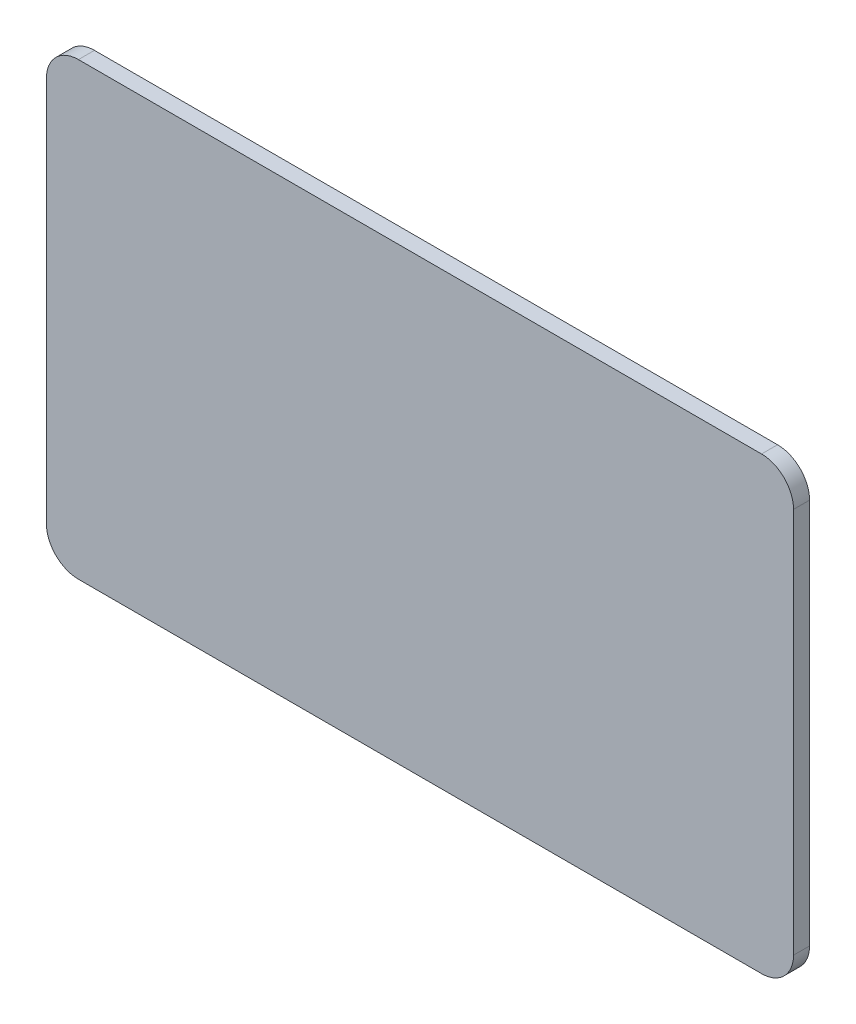
ISO-10303-21;
HEADER;
FILE_DESCRIPTION(('STEP AP214'),'2;1');
FILE_NAME('part.step','',(''),(''),'','','');
FILE_SCHEMA(('AUTOMOTIVE_DESIGN { 1 0 10303 214 1 1 1 1 }'));
ENDSEC;
DATA;
#1=APPLICATION_CONTEXT('core data for automotive mechanical design processes');
#2=APPLICATION_PROTOCOL_DEFINITION('international standard','automotive_design',2000,#1);
#3=PRODUCT_CONTEXT('',#1,'mechanical');
#4=PRODUCT('Part','Part','',(#3));
#5=PRODUCT_RELATED_PRODUCT_CATEGORY('part','',(#4));
#6=PRODUCT_DEFINITION_FORMATION('','',#4);
#7=PRODUCT_DEFINITION_CONTEXT('part definition',#1,'design');
#8=PRODUCT_DEFINITION('design','',#6,#7);
#9=PRODUCT_DEFINITION_SHAPE('','',#8);
#10=(LENGTH_UNIT() NAMED_UNIT(*) SI_UNIT(.MILLI.,.METRE.));
#11=(NAMED_UNIT(*) PLANE_ANGLE_UNIT() SI_UNIT($,.RADIAN.));
#12=(NAMED_UNIT(*) SI_UNIT($,.STERADIAN.) SOLID_ANGLE_UNIT());
#13=UNCERTAINTY_MEASURE_WITH_UNIT(LENGTH_MEASURE(1.E-05),#10,'distance_accuracy_value','');
#14=(GEOMETRIC_REPRESENTATION_CONTEXT(3) GLOBAL_UNCERTAINTY_ASSIGNED_CONTEXT((#13)) GLOBAL_UNIT_ASSIGNED_CONTEXT((#10,
#11,#12)) REPRESENTATION_CONTEXT('',''));
#15=CARTESIAN_POINT('',(0.,0.,0.));
#16=DIRECTION('',(0.,0.,1.));
#17=DIRECTION('',(1.,0.,0.));
#18=AXIS2_PLACEMENT_3D('',#15,#16,#17);
#19=CARTESIAN_POINT('',(23.3495549956615,10.8485399733171,1.));
#20=DIRECTION('',(-1.,0.,0.));
#21=DIRECTION('',(0.,-1.,0.));
#22=AXIS2_PLACEMENT_3D('',#19,#20,#21);
#23=PLANE('',#22);
#24=DIRECTION('',(0.,1.,0.));
#25=VECTOR('',#24,1.);
#26=CARTESIAN_POINT('',(23.3495549956615,10.8485399733171,1.));
#27=LINE('',#26,#25);
#28=CARTESIAN_POINT('',(23.3495549956615,-15.2838407678688,1.));
#29=VERTEX_POINT('',#28);
#30=CARTESIAN_POINT('',(23.3495549956615,8.84853997331711,1.));
#31=VERTEX_POINT('',#30);
#32=EDGE_CURVE('E118',#29,#31,#27,.T.);
#33=ORIENTED_EDGE('',*,*,#32,.F.);
#34=DIRECTION('',(0.,0.,-1.));
#35=VECTOR('',#34,1.);
#36=CARTESIAN_POINT('',(23.3495549956615,-15.2838407678688,1.));
#37=LINE('',#36,#35);
#38=CARTESIAN_POINT('',(23.3495549956615,-15.2838407678688,0.));
#39=VERTEX_POINT('',#38);
#40=EDGE_CURVE('E103',#29,#39,#37,.T.);
#41=ORIENTED_EDGE('',*,*,#40,.T.);
#42=DIRECTION('',(0.,1.,0.));
#43=VECTOR('',#42,1.);
#44=CARTESIAN_POINT('',(23.3495549956615,10.8485399733171,0.));
#45=LINE('',#44,#43);
#46=CARTESIAN_POINT('',(23.3495549956615,8.84853997331711,0.));
#47=VERTEX_POINT('',#46);
#48=EDGE_CURVE('E115',#39,#47,#45,.T.);
#49=ORIENTED_EDGE('',*,*,#48,.T.);
#50=DIRECTION('',(0.,0.,-1.));
#51=VECTOR('',#50,1.);
#52=CARTESIAN_POINT('',(23.3495549956615,8.84853997331711,1.));
#53=LINE('',#52,#51);
#54=EDGE_CURVE('E120',#47,#31,#53,.F.);
#55=ORIENTED_EDGE('',*,*,#54,.T.);
#56=EDGE_LOOP('',(#33,#41,#49,#55));
#57=FACE_BOUND('',#56,.T.);
#58=ADVANCED_FACE('F33',(#57),#23,.F.);
#59=CARTESIAN_POINT('',(-23.3495549956615,10.8485399733171,1.));
#60=DIRECTION('',(0.,-1.,0.));
#61=DIRECTION('',(0.,0.,-1.));
#62=AXIS2_PLACEMENT_3D('',#59,#60,#61);
#63=PLANE('',#62);
#64=DIRECTION('',(-1.,0.,0.));
#65=VECTOR('',#64,1.);
#66=CARTESIAN_POINT('',(-23.3495549956615,10.8485399733171,0.));
#67=LINE('',#66,#65);
#68=CARTESIAN_POINT('',(21.3495549956615,10.8485399733171,0.));
#69=VERTEX_POINT('',#68);
#70=CARTESIAN_POINT('',(-21.3495549956615,10.8485399733171,0.));
#71=VERTEX_POINT('',#70);
#72=EDGE_CURVE('E124',#69,#71,#67,.T.);
#73=ORIENTED_EDGE('',*,*,#72,.T.);
#74=DIRECTION('',(0.,0.,-1.));
#75=VECTOR('',#74,1.);
#76=CARTESIAN_POINT('',(-21.3495549956615,10.8485399733171,1.));
#77=LINE('',#76,#75);
#78=CARTESIAN_POINT('',(-21.3495549956615,10.8485399733171,1.));
#79=VERTEX_POINT('',#78);
#80=EDGE_CURVE('E11',#71,#79,#77,.F.);
#81=ORIENTED_EDGE('',*,*,#80,.T.);
#82=DIRECTION('',(-1.,0.,0.));
#83=VECTOR('',#82,1.);
#84=CARTESIAN_POINT('',(-23.3495549956615,10.8485399733171,1.));
#85=LINE('',#84,#83);
#86=CARTESIAN_POINT('',(21.3495549956615,10.8485399733171,1.));
#87=VERTEX_POINT('',#86);
#88=EDGE_CURVE('E160',#87,#79,#85,.T.);
#89=ORIENTED_EDGE('',*,*,#88,.F.);
#90=DIRECTION('',(0.,0.,-1.));
#91=VECTOR('',#90,1.);
#92=CARTESIAN_POINT('',(21.3495549956615,10.8485399733171,1.));
#93=LINE('',#92,#91);
#94=EDGE_CURVE('E41',#87,#69,#93,.T.);
#95=ORIENTED_EDGE('',*,*,#94,.T.);
#96=EDGE_LOOP('',(#73,#81,#89,#95));
#97=FACE_BOUND('',#96,.T.);
#98=ADVANCED_FACE('F158',(#97),#63,.F.);
#99=CARTESIAN_POINT('',(-23.3495549956615,10.8485399733171,1.));
#100=DIRECTION('',(1.,0.,0.));
#101=DIRECTION('',(0.,0.,-1.));
#102=AXIS2_PLACEMENT_3D('',#99,#100,#101);
#103=PLANE('',#102);
#104=DIRECTION('',(0.,-1.,0.));
#105=VECTOR('',#104,1.);
#106=CARTESIAN_POINT('',(-23.3495549956615,10.8485399733171,0.));
#107=LINE('',#106,#105);
#108=CARTESIAN_POINT('',(-23.3495549956615,8.84853997331711,0.));
#109=VERTEX_POINT('',#108);
#110=CARTESIAN_POINT('',(-23.3495549956615,-15.2838407678688,0.));
#111=VERTEX_POINT('',#110);
#112=EDGE_CURVE('E127',#109,#111,#107,.T.);
#113=ORIENTED_EDGE('',*,*,#112,.T.);
#114=DIRECTION('',(0.,0.,-1.));
#115=VECTOR('',#114,1.);
#116=CARTESIAN_POINT('',(-23.3495549956615,-15.2838407678688,1.));
#117=LINE('',#116,#115);
#118=CARTESIAN_POINT('',(-23.3495549956615,-15.2838407678688,1.));
#119=VERTEX_POINT('',#118);
#120=EDGE_CURVE('E48',#111,#119,#117,.F.);
#121=ORIENTED_EDGE('',*,*,#120,.T.);
#122=DIRECTION('',(0.,-1.,0.));
#123=VECTOR('',#122,1.);
#124=CARTESIAN_POINT('',(-23.3495549956615,10.8485399733171,1.));
#125=LINE('',#124,#123);
#126=CARTESIAN_POINT('',(-23.3495549956615,8.84853997331711,1.));
#127=VERTEX_POINT('',#126);
#128=EDGE_CURVE('E168',#127,#119,#125,.T.);
#129=ORIENTED_EDGE('',*,*,#128,.F.);
#130=DIRECTION('',(0.,0.,-1.));
#131=VECTOR('',#130,1.);
#132=CARTESIAN_POINT('',(-23.3495549956615,8.84853997331711,1.));
#133=LINE('',#132,#131);
#134=EDGE_CURVE('E151',#127,#109,#133,.T.);
#135=ORIENTED_EDGE('',*,*,#134,.T.);
#136=EDGE_LOOP('',(#113,#121,#129,#135));
#137=FACE_BOUND('',#136,.T.);
#138=ADVANCED_FACE('F167',(#137),#103,.F.);
#139=CARTESIAN_POINT('',(-23.3495549956615,-17.2838407678688,1.));
#140=DIRECTION('',(0.,1.,0.));
#141=DIRECTION('',(0.,0.,1.));
#142=AXIS2_PLACEMENT_3D('',#139,#140,#141);
#143=PLANE('',#142);
#144=DIRECTION('',(1.,0.,0.));
#145=VECTOR('',#144,1.);
#146=CARTESIAN_POINT('',(-23.3495549956615,-17.2838407678688,0.));
#147=LINE('',#146,#145);
#148=CARTESIAN_POINT('',(-21.3495549956615,-17.2838407678688,0.));
#149=VERTEX_POINT('',#148);
#150=CARTESIAN_POINT('',(21.3495549956615,-17.2838407678688,0.));
#151=VERTEX_POINT('',#150);
#152=EDGE_CURVE('E134',#149,#151,#147,.T.);
#153=ORIENTED_EDGE('',*,*,#152,.T.);
#154=DIRECTION('',(0.,0.,-1.));
#155=VECTOR('',#154,1.);
#156=CARTESIAN_POINT('',(21.3495549956615,-17.2838407678688,1.));
#157=LINE('',#156,#155);
#158=CARTESIAN_POINT('',(21.3495549956615,-17.2838407678688,1.));
#159=VERTEX_POINT('',#158);
#160=EDGE_CURVE('E104',#151,#159,#157,.F.);
#161=ORIENTED_EDGE('',*,*,#160,.T.);
#162=DIRECTION('',(1.,0.,0.));
#163=VECTOR('',#162,1.);
#164=CARTESIAN_POINT('',(-23.3495549956615,-17.2838407678688,1.));
#165=LINE('',#164,#163);
#166=CARTESIAN_POINT('',(-21.3495549956615,-17.2838407678688,1.));
#167=VERTEX_POINT('',#166);
#168=EDGE_CURVE('E130',#167,#159,#165,.T.);
#169=ORIENTED_EDGE('',*,*,#168,.F.);
#170=DIRECTION('',(0.,0.,-1.));
#171=VECTOR('',#170,1.);
#172=CARTESIAN_POINT('',(-21.3495549956615,-17.2838407678688,1.));
#173=LINE('',#172,#171);
#174=EDGE_CURVE('E109',#167,#149,#173,.T.);
#175=ORIENTED_EDGE('',*,*,#174,.T.);
#176=EDGE_LOOP('',(#153,#161,#169,#175));
#177=FACE_BOUND('',#176,.T.);
#178=ADVANCED_FACE('F196',(#177),#143,.F.);
#179=CARTESIAN_POINT('',(0.,0.,1.));
#180=DIRECTION('',(0.,0.,1.));
#181=DIRECTION('',(1.,0.,0.));
#182=AXIS2_PLACEMENT_3D('',#179,#180,#181);
#183=PLANE('',#182);
#184=ORIENTED_EDGE('',*,*,#168,.T.);
#185=CARTESIAN_POINT('',(21.3495549956615,-15.2838407678688,1.));
#186=DIRECTION('',(0.,0.,1.));
#187=DIRECTION('',(1.,0.,0.));
#188=AXIS2_PLACEMENT_3D('',#185,#186,#187);
#189=CIRCLE('',#188,2.);
#190=EDGE_CURVE('E149',#159,#29,#189,.T.);
#191=ORIENTED_EDGE('',*,*,#190,.T.);
#192=ORIENTED_EDGE('',*,*,#32,.T.);
#193=CARTESIAN_POINT('',(21.3495549956615,8.84853997331711,1.));
#194=DIRECTION('',(0.,0.,1.));
#195=DIRECTION('',(1.,0.,0.));
#196=AXIS2_PLACEMENT_3D('',#193,#194,#195);
#197=CIRCLE('',#196,2.);
#198=EDGE_CURVE('E144',#31,#87,#197,.T.);
#199=ORIENTED_EDGE('',*,*,#198,.T.);
#200=ORIENTED_EDGE('',*,*,#88,.T.);
#201=CARTESIAN_POINT('',(-21.3495549956615,8.84853997331711,1.));
#202=DIRECTION('',(0.,0.,1.));
#203=DIRECTION('',(1.,0.,0.));
#204=AXIS2_PLACEMENT_3D('',#201,#202,#203);
#205=CIRCLE('',#204,2.);
#206=EDGE_CURVE('E55',#79,#127,#205,.T.);
#207=ORIENTED_EDGE('',*,*,#206,.T.);
#208=ORIENTED_EDGE('',*,*,#128,.T.);
#209=CARTESIAN_POINT('',(-21.3495549956615,-15.2838407678688,1.));
#210=DIRECTION('',(0.,0.,1.));
#211=DIRECTION('',(1.,0.,0.));
#212=AXIS2_PLACEMENT_3D('',#209,#210,#211);
#213=CIRCLE('',#212,2.);
#214=EDGE_CURVE('E147',#119,#167,#213,.T.);
#215=ORIENTED_EDGE('',*,*,#214,.T.);
#216=EDGE_LOOP('',(#184,#191,#192,#199,#200,#207,#208,#215));
#217=FACE_BOUND('',#216,.T.);
#218=ADVANCED_FACE('F173',(#217),#183,.T.);
#219=CARTESIAN_POINT('',(0.,0.,0.));
#220=DIRECTION('',(0.,0.,1.));
#221=DIRECTION('',(1.,0.,0.));
#222=AXIS2_PLACEMENT_3D('',#219,#220,#221);
#223=PLANE('',#222);
#224=ORIENTED_EDGE('',*,*,#48,.F.);
#225=CARTESIAN_POINT('',(21.3495549956615,-15.2838407678688,0.));
#226=DIRECTION('',(0.,0.,1.));
#227=DIRECTION('',(1.,0.,0.));
#228=AXIS2_PLACEMENT_3D('',#225,#226,#227);
#229=CIRCLE('',#228,2.);
#230=EDGE_CURVE('E99',#39,#151,#229,.F.);
#231=ORIENTED_EDGE('',*,*,#230,.T.);
#232=ORIENTED_EDGE('',*,*,#152,.F.);
#233=CARTESIAN_POINT('',(-21.3495549956615,-15.2838407678688,0.));
#234=DIRECTION('',(0.,0.,1.));
#235=DIRECTION('',(1.,0.,0.));
#236=AXIS2_PLACEMENT_3D('',#233,#234,#235);
#237=CIRCLE('',#236,2.);
#238=EDGE_CURVE('E110',#149,#111,#237,.F.);
#239=ORIENTED_EDGE('',*,*,#238,.T.);
#240=ORIENTED_EDGE('',*,*,#112,.F.);
#241=CARTESIAN_POINT('',(-21.3495549956615,8.84853997331711,0.));
#242=DIRECTION('',(0.,0.,1.));
#243=DIRECTION('',(1.,0.,0.));
#244=AXIS2_PLACEMENT_3D('',#241,#242,#243);
#245=CIRCLE('',#244,2.);
#246=EDGE_CURVE('E138',#109,#71,#245,.F.);
#247=ORIENTED_EDGE('',*,*,#246,.T.);
#248=ORIENTED_EDGE('',*,*,#72,.F.);
#249=CARTESIAN_POINT('',(21.3495549956615,8.84853997331711,0.));
#250=DIRECTION('',(0.,0.,1.));
#251=DIRECTION('',(1.,0.,0.));
#252=AXIS2_PLACEMENT_3D('',#249,#250,#251);
#253=CIRCLE('',#252,2.);
#254=EDGE_CURVE('E119',#69,#47,#253,.F.);
#255=ORIENTED_EDGE('',*,*,#254,.T.);
#256=EDGE_LOOP('',(#224,#231,#232,#239,#240,#247,#248,#255));
#257=FACE_BOUND('',#256,.T.);
#258=ADVANCED_FACE('F122',(#257),#223,.F.);
#259=CARTESIAN_POINT('',(21.3495549956615,-15.2838407678688,1.));
#260=DIRECTION('',(0.,0.,-1.));
#261=DIRECTION('',(-1.,0.,0.));
#262=AXIS2_PLACEMENT_3D('',#259,#260,#261);
#263=CYLINDRICAL_SURFACE('',#262,2.);
#264=ORIENTED_EDGE('',*,*,#190,.F.);
#265=ORIENTED_EDGE('',*,*,#160,.F.);
#266=ORIENTED_EDGE('',*,*,#230,.F.);
#267=ORIENTED_EDGE('',*,*,#40,.F.);
#268=EDGE_LOOP('',(#264,#265,#266,#267));
#269=FACE_BOUND('',#268,.T.);
#270=ADVANCED_FACE('F102',(#269),#263,.T.);
#271=CARTESIAN_POINT('',(-21.3495549956615,-15.2838407678688,1.));
#272=DIRECTION('',(0.,0.,-1.));
#273=DIRECTION('',(-1.,0.,0.));
#274=AXIS2_PLACEMENT_3D('',#271,#272,#273);
#275=CYLINDRICAL_SURFACE('',#274,2.);
#276=ORIENTED_EDGE('',*,*,#214,.F.);
#277=ORIENTED_EDGE('',*,*,#120,.F.);
#278=ORIENTED_EDGE('',*,*,#238,.F.);
#279=ORIENTED_EDGE('',*,*,#174,.F.);
#280=EDGE_LOOP('',(#276,#277,#278,#279));
#281=FACE_BOUND('',#280,.T.);
#282=ADVANCED_FACE('F178',(#281),#275,.T.);
#283=CARTESIAN_POINT('',(-21.3495549956615,8.84853997331711,1.));
#284=DIRECTION('',(0.,0.,-1.));
#285=DIRECTION('',(-1.,0.,0.));
#286=AXIS2_PLACEMENT_3D('',#283,#284,#285);
#287=CYLINDRICAL_SURFACE('',#286,2.);
#288=ORIENTED_EDGE('',*,*,#206,.F.);
#289=ORIENTED_EDGE('',*,*,#80,.F.);
#290=ORIENTED_EDGE('',*,*,#246,.F.);
#291=ORIENTED_EDGE('',*,*,#134,.F.);
#292=EDGE_LOOP('',(#288,#289,#290,#291));
#293=FACE_BOUND('',#292,.T.);
#294=ADVANCED_FACE('F166',(#293),#287,.T.);
#295=CARTESIAN_POINT('',(21.3495549956615,8.84853997331711,1.));
#296=DIRECTION('',(0.,0.,-1.));
#297=DIRECTION('',(-1.,0.,0.));
#298=AXIS2_PLACEMENT_3D('',#295,#296,#297);
#299=CYLINDRICAL_SURFACE('',#298,2.);
#300=ORIENTED_EDGE('',*,*,#198,.F.);
#301=ORIENTED_EDGE('',*,*,#54,.F.);
#302=ORIENTED_EDGE('',*,*,#254,.F.);
#303=ORIENTED_EDGE('',*,*,#94,.F.);
#304=EDGE_LOOP('',(#300,#301,#302,#303));
#305=FACE_BOUND('',#304,.T.);
#306=ADVANCED_FACE('F35',(#305),#299,.T.);
#307=CLOSED_SHELL('',(#58,#98,#138,#178,#218,#258,#270,#282,#294,#306));
#308=MANIFOLD_SOLID_BREP('B2',#307);
#309=ADVANCED_BREP_SHAPE_REPRESENTATION('',(#18,#308),#14);
#310=SHAPE_DEFINITION_REPRESENTATION(#9,#309);
ENDSEC;
END-ISO-10303-21;
